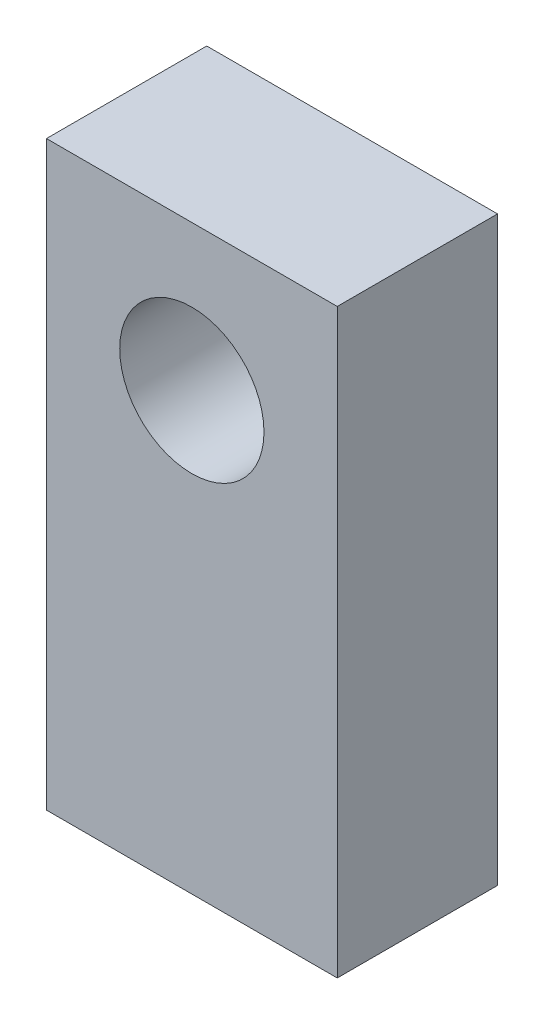
ISO-10303-21;
HEADER;
FILE_DESCRIPTION(('STEP AP214'),'2;1');
FILE_NAME('part.step','',(''),(''),'','','');
FILE_SCHEMA(('AUTOMOTIVE_DESIGN { 1 0 10303 214 1 1 1 1 }'));
ENDSEC;
DATA;
#1=APPLICATION_CONTEXT('core data for automotive mechanical design processes');
#2=APPLICATION_PROTOCOL_DEFINITION('international standard','automotive_design',2000,#1);
#3=PRODUCT_CONTEXT('',#1,'mechanical');
#4=PRODUCT('Part','Part','',(#3));
#5=PRODUCT_RELATED_PRODUCT_CATEGORY('part','',(#4));
#6=PRODUCT_DEFINITION_FORMATION('','',#4);
#7=PRODUCT_DEFINITION_CONTEXT('part definition',#1,'design');
#8=PRODUCT_DEFINITION('design','',#6,#7);
#9=PRODUCT_DEFINITION_SHAPE('','',#8);
#10=(LENGTH_UNIT() NAMED_UNIT(*) SI_UNIT(.MILLI.,.METRE.));
#11=(NAMED_UNIT(*) PLANE_ANGLE_UNIT() SI_UNIT($,.RADIAN.));
#12=(NAMED_UNIT(*) SI_UNIT($,.STERADIAN.) SOLID_ANGLE_UNIT());
#13=UNCERTAINTY_MEASURE_WITH_UNIT(LENGTH_MEASURE(1.E-05),#10,'distance_accuracy_value','');
#14=(GEOMETRIC_REPRESENTATION_CONTEXT(3) GLOBAL_UNCERTAINTY_ASSIGNED_CONTEXT((#13)) GLOBAL_UNIT_ASSIGNED_CONTEXT((#10,
#11,#12)) REPRESENTATION_CONTEXT('',''));
#15=CARTESIAN_POINT('',(0.,0.,0.));
#16=DIRECTION('',(0.,0.,1.));
#17=DIRECTION('',(1.,0.,0.));
#18=AXIS2_PLACEMENT_3D('',#15,#16,#17);
#19=CARTESIAN_POINT('',(0.,0.,3.5));
#20=DIRECTION('',(0.,0.,-1.));
#21=DIRECTION('',(-1.,0.,0.));
#22=AXIS2_PLACEMENT_3D('',#19,#20,#21);
#23=PLANE('',#22);
#24=DIRECTION('',(0.,-1.,0.));
#25=VECTOR('',#24,1.);
#26=CARTESIAN_POINT('',(0.,0.,3.5));
#27=LINE('',#26,#25);
#28=CARTESIAN_POINT('',(0.,12.7,3.5));
#29=VERTEX_POINT('',#28);
#30=CARTESIAN_POINT('',(0.,0.,3.5));
#31=VERTEX_POINT('',#30);
#32=EDGE_CURVE('E69',#29,#31,#27,.T.);
#33=ORIENTED_EDGE('',*,*,#32,.T.);
#34=DIRECTION('',(1.,0.,0.));
#35=VECTOR('',#34,1.);
#36=CARTESIAN_POINT('',(0.,0.,3.5));
#37=LINE('',#36,#35);
#38=CARTESIAN_POINT('',(6.35,0.,3.5));
#39=VERTEX_POINT('',#38);
#40=EDGE_CURVE('E64',#31,#39,#37,.T.);
#41=ORIENTED_EDGE('',*,*,#40,.T.);
#42=DIRECTION('',(0.,1.,0.));
#43=VECTOR('',#42,1.);
#44=CARTESIAN_POINT('',(6.35,0.,3.5));
#45=LINE('',#44,#43);
#46=CARTESIAN_POINT('',(6.35,12.7,3.5));
#47=VERTEX_POINT('',#46);
#48=EDGE_CURVE('E67',#39,#47,#45,.T.);
#49=ORIENTED_EDGE('',*,*,#48,.T.);
#50=DIRECTION('',(-1.,0.,0.));
#51=VECTOR('',#50,1.);
#52=CARTESIAN_POINT('',(0.,12.7,3.5));
#53=LINE('',#52,#51);
#54=EDGE_CURVE('E34',#47,#29,#53,.T.);
#55=ORIENTED_EDGE('',*,*,#54,.T.);
#56=EDGE_LOOP('',(#33,#41,#49,#55));
#57=FACE_BOUND('',#56,.T.);
#58=CARTESIAN_POINT('',(3.175,9.525,3.5));
#59=DIRECTION('',(0.,0.,1.));
#60=DIRECTION('',(1.,0.,0.));
#61=AXIS2_PLACEMENT_3D('',#58,#59,#60);
#62=CIRCLE('',#61,1.575000025);
#63=CARTESIAN_POINT('',(4.750000025,9.525,3.5));
#64=VERTEX_POINT('',#63);
#65=EDGE_CURVE('E84',#64,#64,#62,.T.);
#66=ORIENTED_EDGE('',*,*,#65,.F.);
#67=EDGE_LOOP('',(#66));
#68=FACE_BOUND('',#67,.T.);
#69=ADVANCED_FACE('F17',(#57,#68),#23,.F.);
#70=CARTESIAN_POINT('',(0.,0.,0.));
#71=DIRECTION('',(0.,0.,-1.));
#72=DIRECTION('',(-1.,0.,0.));
#73=AXIS2_PLACEMENT_3D('',#70,#71,#72);
#74=PLANE('',#73);
#75=DIRECTION('',(0.,-1.,0.));
#76=VECTOR('',#75,1.);
#77=CARTESIAN_POINT('',(0.,0.,0.));
#78=LINE('',#77,#76);
#79=CARTESIAN_POINT('',(0.,12.7,0.));
#80=VERTEX_POINT('',#79);
#81=CARTESIAN_POINT('',(0.,0.,0.));
#82=VERTEX_POINT('',#81);
#83=EDGE_CURVE('E81',#80,#82,#78,.T.);
#84=ORIENTED_EDGE('',*,*,#83,.F.);
#85=DIRECTION('',(-1.,0.,0.));
#86=VECTOR('',#85,1.);
#87=CARTESIAN_POINT('',(0.,12.7,0.));
#88=LINE('',#87,#86);
#89=CARTESIAN_POINT('',(6.35,12.7,0.));
#90=VERTEX_POINT('',#89);
#91=EDGE_CURVE('E57',#90,#80,#88,.T.);
#92=ORIENTED_EDGE('',*,*,#91,.F.);
#93=DIRECTION('',(0.,1.,0.));
#94=VECTOR('',#93,1.);
#95=CARTESIAN_POINT('',(6.35,0.,0.));
#96=LINE('',#95,#94);
#97=CARTESIAN_POINT('',(6.35,0.,0.));
#98=VERTEX_POINT('',#97);
#99=EDGE_CURVE('E51',#98,#90,#96,.T.);
#100=ORIENTED_EDGE('',*,*,#99,.F.);
#101=DIRECTION('',(1.,0.,0.));
#102=VECTOR('',#101,1.);
#103=CARTESIAN_POINT('',(0.,0.,0.));
#104=LINE('',#103,#102);
#105=EDGE_CURVE('E73',#82,#98,#104,.T.);
#106=ORIENTED_EDGE('',*,*,#105,.F.);
#107=EDGE_LOOP('',(#84,#92,#100,#106));
#108=FACE_BOUND('',#107,.T.);
#109=CARTESIAN_POINT('',(3.175,9.525,0.));
#110=DIRECTION('',(0.,0.,1.));
#111=DIRECTION('',(1.,0.,0.));
#112=AXIS2_PLACEMENT_3D('',#109,#110,#111);
#113=CIRCLE('',#112,1.575000025);
#114=CARTESIAN_POINT('',(4.750000025,9.525,0.));
#115=VERTEX_POINT('',#114);
#116=EDGE_CURVE('E96',#115,#115,#113,.T.);
#117=ORIENTED_EDGE('',*,*,#116,.T.);
#118=EDGE_LOOP('',(#117));
#119=FACE_BOUND('',#118,.T.);
#120=ADVANCED_FACE('F92',(#108,#119),#74,.T.);
#121=CARTESIAN_POINT('',(0.,0.,3.5));
#122=DIRECTION('',(1.,0.,0.));
#123=DIRECTION('',(0.,0.,-1.));
#124=AXIS2_PLACEMENT_3D('',#121,#122,#123);
#125=PLANE('',#124);
#126=ORIENTED_EDGE('',*,*,#83,.T.);
#127=DIRECTION('',(0.,0.,-1.));
#128=VECTOR('',#127,1.);
#129=CARTESIAN_POINT('',(0.,0.,3.5));
#130=LINE('',#129,#128);
#131=EDGE_CURVE('E11',#31,#82,#130,.T.);
#132=ORIENTED_EDGE('',*,*,#131,.F.);
#133=ORIENTED_EDGE('',*,*,#32,.F.);
#134=DIRECTION('',(0.,0.,-1.));
#135=VECTOR('',#134,1.);
#136=CARTESIAN_POINT('',(0.,12.7,3.5));
#137=LINE('',#136,#135);
#138=EDGE_CURVE('E77',#29,#80,#137,.T.);
#139=ORIENTED_EDGE('',*,*,#138,.T.);
#140=EDGE_LOOP('',(#126,#132,#133,#139));
#141=FACE_BOUND('',#140,.T.);
#142=ADVANCED_FACE('F19',(#141),#125,.F.);
#143=CARTESIAN_POINT('',(0.,0.,3.5));
#144=DIRECTION('',(0.,1.,0.));
#145=DIRECTION('',(0.,0.,1.));
#146=AXIS2_PLACEMENT_3D('',#143,#144,#145);
#147=PLANE('',#146);
#148=CARTESIAN_POINT('',(3.175,0.,1.750000056));
#149=DIRECTION('',(0.,-1.,0.));
#150=DIRECTION('',(0.,0.,-1.));
#151=AXIS2_PLACEMENT_3D('',#148,#149,#150);
#152=CIRCLE('',#151,0.9652);
#153=CARTESIAN_POINT('',(3.175,0.,0.784800056));
#154=VERTEX_POINT('',#153);
#155=EDGE_CURVE('E102',#154,#154,#152,.T.);
#156=ORIENTED_EDGE('',*,*,#155,.F.);
#157=EDGE_LOOP('',(#156));
#158=FACE_BOUND('',#157,.T.);
#159=ORIENTED_EDGE('',*,*,#105,.T.);
#160=DIRECTION('',(0.,0.,-1.));
#161=VECTOR('',#160,1.);
#162=CARTESIAN_POINT('',(6.35,0.,3.5));
#163=LINE('',#162,#161);
#164=EDGE_CURVE('E26',#39,#98,#163,.T.);
#165=ORIENTED_EDGE('',*,*,#164,.F.);
#166=ORIENTED_EDGE('',*,*,#40,.F.);
#167=ORIENTED_EDGE('',*,*,#131,.T.);
#168=EDGE_LOOP('',(#159,#165,#166,#167));
#169=FACE_BOUND('',#168,.T.);
#170=ADVANCED_FACE('F72',(#158,#169),#147,.F.);
#171=CARTESIAN_POINT('',(6.35,0.,3.5));
#172=DIRECTION('',(-1.,0.,0.));
#173=DIRECTION('',(0.,0.,1.));
#174=AXIS2_PLACEMENT_3D('',#171,#172,#173);
#175=PLANE('',#174);
#176=ORIENTED_EDGE('',*,*,#99,.T.);
#177=DIRECTION('',(0.,0.,-1.));
#178=VECTOR('',#177,1.);
#179=CARTESIAN_POINT('',(6.35,12.7,3.5));
#180=LINE('',#179,#178);
#181=EDGE_CURVE('E74',#47,#90,#180,.T.);
#182=ORIENTED_EDGE('',*,*,#181,.F.);
#183=ORIENTED_EDGE('',*,*,#48,.F.);
#184=ORIENTED_EDGE('',*,*,#164,.T.);
#185=EDGE_LOOP('',(#176,#182,#183,#184));
#186=FACE_BOUND('',#185,.T.);
#187=ADVANCED_FACE('F75',(#186),#175,.F.);
#188=CARTESIAN_POINT('',(0.,12.7,3.5));
#189=DIRECTION('',(0.,-1.,0.));
#190=DIRECTION('',(0.,0.,-1.));
#191=AXIS2_PLACEMENT_3D('',#188,#189,#190);
#192=PLANE('',#191);
#193=ORIENTED_EDGE('',*,*,#91,.T.);
#194=ORIENTED_EDGE('',*,*,#138,.F.);
#195=ORIENTED_EDGE('',*,*,#54,.F.);
#196=ORIENTED_EDGE('',*,*,#181,.T.);
#197=EDGE_LOOP('',(#193,#194,#195,#196));
#198=FACE_BOUND('',#197,.T.);
#199=ADVANCED_FACE('F89',(#198),#192,.F.);
#200=CARTESIAN_POINT('',(3.175,9.525,3.5));
#201=DIRECTION('',(0.,0.,-1.));
#202=DIRECTION('',(-1.,0.,0.));
#203=AXIS2_PLACEMENT_3D('',#200,#201,#202);
#204=CYLINDRICAL_SURFACE('',#203,1.575000025);
#205=ORIENTED_EDGE('',*,*,#65,.T.);
#206=EDGE_LOOP('',(#205));
#207=FACE_BOUND('',#206,.T.);
#208=ORIENTED_EDGE('',*,*,#116,.F.);
#209=EDGE_LOOP('',(#208));
#210=FACE_BOUND('',#209,.T.);
#211=ADVANCED_FACE('F113',(#207,#210),#204,.F.);
#212=CARTESIAN_POINT('',(3.175,6.858,1.750000056));
#213=DIRECTION('',(0.,-1.,0.));
#214=DIRECTION('',(0.,0.,-1.));
#215=AXIS2_PLACEMENT_3D('',#212,#213,#214);
#216=CYLINDRICAL_SURFACE('',#215,0.9652);
#217=CARTESIAN_POINT('',(3.175,6.858,1.750000056));
#218=DIRECTION('',(0.,-1.,0.));
#219=DIRECTION('',(0.,0.,-1.));
#220=AXIS2_PLACEMENT_3D('',#217,#218,#219);
#221=CIRCLE('',#220,0.9652);
#222=CARTESIAN_POINT('',(3.175,6.858,0.784800056));
#223=VERTEX_POINT('',#222);
#224=EDGE_CURVE('E99',#223,#223,#221,.T.);
#225=ORIENTED_EDGE('',*,*,#224,.F.);
#226=EDGE_LOOP('',(#225));
#227=FACE_BOUND('',#226,.T.);
#228=ORIENTED_EDGE('',*,*,#155,.T.);
#229=EDGE_LOOP('',(#228));
#230=FACE_BOUND('',#229,.T.);
#231=ADVANCED_FACE('F110',(#227,#230),#216,.F.);
#232=CARTESIAN_POINT('',(3.175,6.858,1.750000056));
#233=DIRECTION('',(0.,-1.,0.));
#234=DIRECTION('',(0.,0.,-1.));
#235=AXIS2_PLACEMENT_3D('',#232,#233,#234);
#236=PLANE('',#235);
#237=ORIENTED_EDGE('',*,*,#224,.T.);
#238=EDGE_LOOP('',(#237));
#239=FACE_BOUND('',#238,.T.);
#240=ADVANCED_FACE('F108',(#239),#236,.T.);
#241=CLOSED_SHELL('',(#69,#120,#142,#170,#187,#199,#211,#231,#240));
#242=MANIFOLD_SOLID_BREP('B1',#241);
#243=ADVANCED_BREP_SHAPE_REPRESENTATION('',(#18,#242),#14);
#244=SHAPE_DEFINITION_REPRESENTATION(#9,#243);
ENDSEC;
END-ISO-10303-21;
